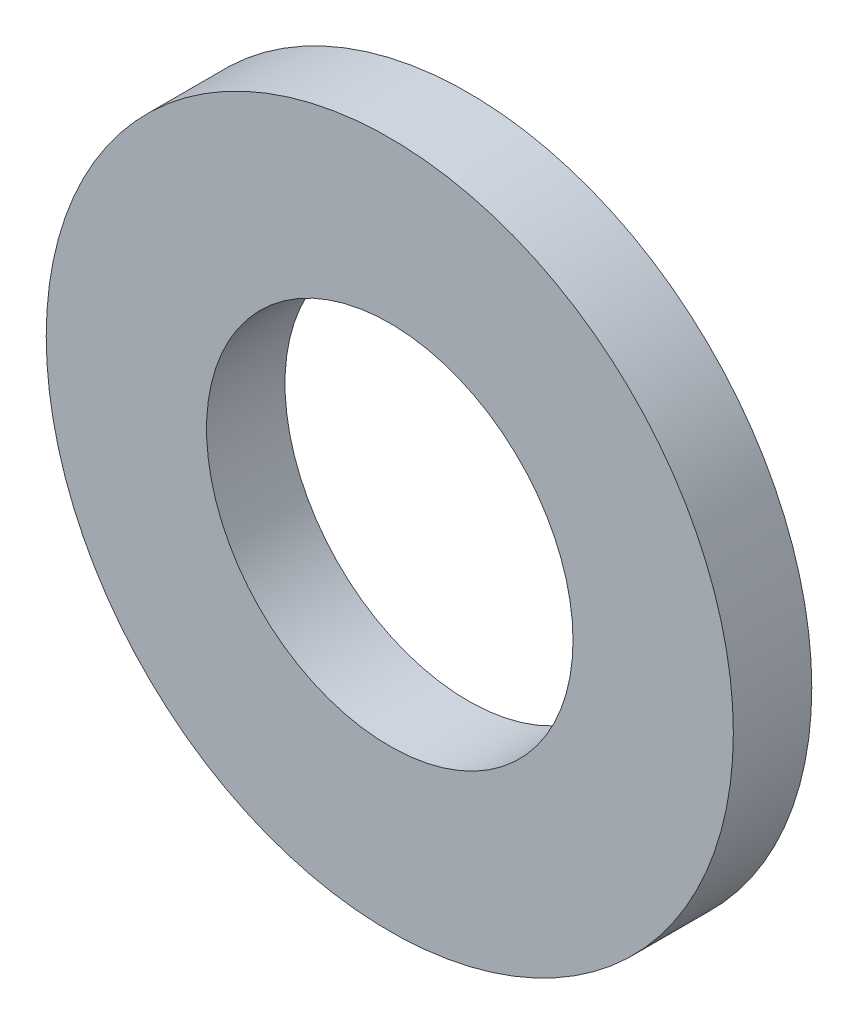
ISO-10303-21;
HEADER;
FILE_DESCRIPTION(('STEP AP214'),'2;1');
FILE_NAME('part.step','',(''),(''),'','','');
FILE_SCHEMA(('AUTOMOTIVE_DESIGN { 1 0 10303 214 1 1 1 1 }'));
ENDSEC;
DATA;
#1=APPLICATION_CONTEXT('core data for automotive mechanical design processes');
#2=APPLICATION_PROTOCOL_DEFINITION('international standard','automotive_design',2000,#1);
#3=PRODUCT_CONTEXT('',#1,'mechanical');
#4=PRODUCT('Part','Part','',(#3));
#5=PRODUCT_RELATED_PRODUCT_CATEGORY('part','',(#4));
#6=PRODUCT_DEFINITION_FORMATION('','',#4);
#7=PRODUCT_DEFINITION_CONTEXT('part definition',#1,'design');
#8=PRODUCT_DEFINITION('design','',#6,#7);
#9=PRODUCT_DEFINITION_SHAPE('','',#8);
#10=(LENGTH_UNIT() NAMED_UNIT(*) SI_UNIT(.MILLI.,.METRE.));
#11=(NAMED_UNIT(*) PLANE_ANGLE_UNIT() SI_UNIT($,.RADIAN.));
#12=(NAMED_UNIT(*) SI_UNIT($,.STERADIAN.) SOLID_ANGLE_UNIT());
#13=UNCERTAINTY_MEASURE_WITH_UNIT(LENGTH_MEASURE(1.E-05),#10,'distance_accuracy_value','');
#14=(GEOMETRIC_REPRESENTATION_CONTEXT(3) GLOBAL_UNCERTAINTY_ASSIGNED_CONTEXT((#13)) GLOBAL_UNIT_ASSIGNED_CONTEXT((#10,
#11,#12)) REPRESENTATION_CONTEXT('',''));
#15=CARTESIAN_POINT('',(0.,0.,0.));
#16=DIRECTION('',(0.,0.,1.));
#17=DIRECTION('',(1.,0.,0.));
#18=AXIS2_PLACEMENT_3D('',#15,#16,#17);
#19=CARTESIAN_POINT('',(0.,0.,-1.37));
#20=DIRECTION('',(0.,0.,1.));
#21=DIRECTION('',(1.,0.,0.));
#22=AXIS2_PLACEMENT_3D('',#19,#20,#21);
#23=CYLINDRICAL_SURFACE('',#22,6.);
#24=CARTESIAN_POINT('',(0.,0.,-1.37));
#25=DIRECTION('',(0.,0.,1.));
#26=DIRECTION('',(1.,0.,0.));
#27=AXIS2_PLACEMENT_3D('',#24,#25,#26);
#28=CIRCLE('',#27,6.);
#29=CARTESIAN_POINT('',(6.,0.,-1.37));
#30=VERTEX_POINT('',#29);
#31=EDGE_CURVE('E10',#30,#30,#28,.T.);
#32=ORIENTED_EDGE('',*,*,#31,.T.);
#33=EDGE_LOOP('',(#32));
#34=FACE_BOUND('',#33,.T.);
#35=CARTESIAN_POINT('',(0.,0.,0.));
#36=DIRECTION('',(0.,0.,1.));
#37=DIRECTION('',(1.,0.,0.));
#38=AXIS2_PLACEMENT_3D('',#35,#36,#37);
#39=CIRCLE('',#38,6.);
#40=CARTESIAN_POINT('',(6.,0.,0.));
#41=VERTEX_POINT('',#40);
#42=EDGE_CURVE('E33',#41,#41,#39,.T.);
#43=ORIENTED_EDGE('',*,*,#42,.F.);
#44=EDGE_LOOP('',(#43));
#45=FACE_BOUND('',#44,.T.);
#46=ADVANCED_FACE('F30',(#34,#45),#23,.T.);
#47=CARTESIAN_POINT('',(0.,0.,-1.37));
#48=DIRECTION('',(0.,0.,1.));
#49=DIRECTION('',(1.,0.,0.));
#50=AXIS2_PLACEMENT_3D('',#47,#48,#49);
#51=PLANE('',#50);
#52=CARTESIAN_POINT('',(0.,0.,-1.37));
#53=DIRECTION('',(0.,0.,1.));
#54=DIRECTION('',(1.,0.,0.));
#55=AXIS2_PLACEMENT_3D('',#52,#53,#54);
#56=CIRCLE('',#55,3.2);
#57=CARTESIAN_POINT('',(3.2,0.,-1.37));
#58=VERTEX_POINT('',#57);
#59=EDGE_CURVE('E40',#58,#58,#56,.T.);
#60=ORIENTED_EDGE('',*,*,#59,.T.);
#61=EDGE_LOOP('',(#60));
#62=FACE_BOUND('',#61,.T.);
#63=ORIENTED_EDGE('',*,*,#31,.F.);
#64=EDGE_LOOP('',(#63));
#65=FACE_BOUND('',#64,.T.);
#66=ADVANCED_FACE('F48',(#62,#65),#51,.F.);
#67=CARTESIAN_POINT('',(0.,0.,0.));
#68=DIRECTION('',(0.,0.,1.));
#69=DIRECTION('',(1.,0.,0.));
#70=AXIS2_PLACEMENT_3D('',#67,#68,#69);
#71=PLANE('',#70);
#72=CARTESIAN_POINT('',(0.,0.,0.));
#73=DIRECTION('',(0.,0.,1.));
#74=DIRECTION('',(1.,0.,0.));
#75=AXIS2_PLACEMENT_3D('',#72,#73,#74);
#76=CIRCLE('',#75,3.2);
#77=CARTESIAN_POINT('',(3.2,0.,0.));
#78=VERTEX_POINT('',#77);
#79=EDGE_CURVE('E42',#78,#78,#76,.T.);
#80=ORIENTED_EDGE('',*,*,#79,.F.);
#81=EDGE_LOOP('',(#80));
#82=FACE_BOUND('',#81,.T.);
#83=ORIENTED_EDGE('',*,*,#42,.T.);
#84=EDGE_LOOP('',(#83));
#85=FACE_BOUND('',#84,.T.);
#86=ADVANCED_FACE('F54',(#82,#85),#71,.T.);
#87=CARTESIAN_POINT('',(0.,0.,-1.37));
#88=DIRECTION('',(0.,0.,1.));
#89=DIRECTION('',(1.,0.,0.));
#90=AXIS2_PLACEMENT_3D('',#87,#88,#89);
#91=CYLINDRICAL_SURFACE('',#90,3.2);
#92=ORIENTED_EDGE('',*,*,#59,.F.);
#93=EDGE_LOOP('',(#92));
#94=FACE_BOUND('',#93,.T.);
#95=ORIENTED_EDGE('',*,*,#79,.T.);
#96=EDGE_LOOP('',(#95));
#97=FACE_BOUND('',#96,.T.);
#98=ADVANCED_FACE('F51',(#94,#97),#91,.F.);
#99=CLOSED_SHELL('',(#46,#66,#86,#98));
#100=MANIFOLD_SOLID_BREP('B2',#99);
#101=ADVANCED_BREP_SHAPE_REPRESENTATION('',(#18,#100),#14);
#102=SHAPE_DEFINITION_REPRESENTATION(#9,#101);
ENDSEC;
END-ISO-10303-21;
